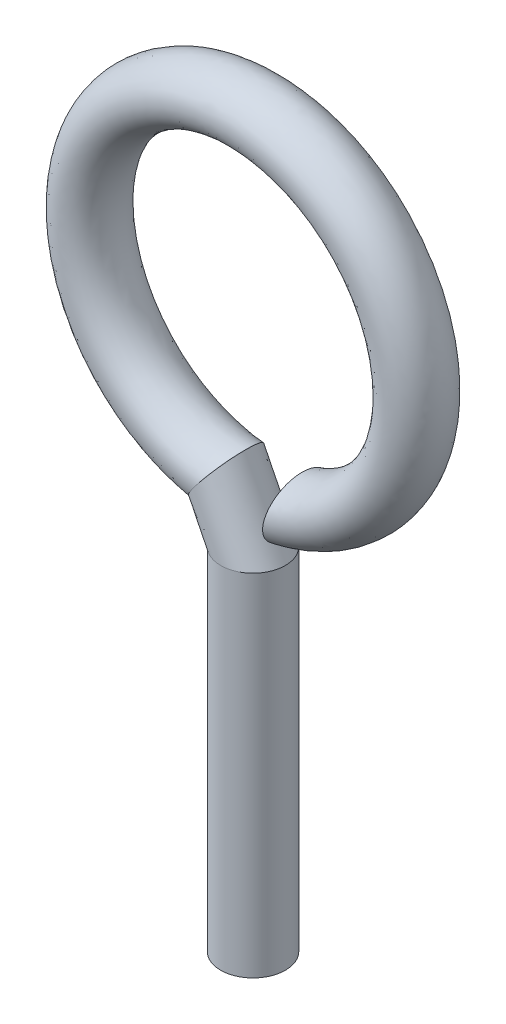
ISO-10303-21;
HEADER;
FILE_DESCRIPTION(('STEP AP214'),'2;1');
FILE_NAME('part.step','',(''),(''),'','','');
FILE_SCHEMA(('AUTOMOTIVE_DESIGN { 1 0 10303 214 1 1 1 1 }'));
ENDSEC;
DATA;
#1=APPLICATION_CONTEXT('core data for automotive mechanical design processes');
#2=APPLICATION_PROTOCOL_DEFINITION('international standard','automotive_design',2000,#1);
#3=PRODUCT_CONTEXT('',#1,'mechanical');
#4=PRODUCT('Part','Part','',(#3));
#5=PRODUCT_RELATED_PRODUCT_CATEGORY('part','',(#4));
#6=PRODUCT_DEFINITION_FORMATION('','',#4);
#7=PRODUCT_DEFINITION_CONTEXT('part definition',#1,'design');
#8=PRODUCT_DEFINITION('design','',#6,#7);
#9=PRODUCT_DEFINITION_SHAPE('','',#8);
#10=(LENGTH_UNIT() NAMED_UNIT(*) SI_UNIT(.MILLI.,.METRE.));
#11=(NAMED_UNIT(*) PLANE_ANGLE_UNIT() SI_UNIT($,.RADIAN.));
#12=(NAMED_UNIT(*) SI_UNIT($,.STERADIAN.) SOLID_ANGLE_UNIT());
#13=UNCERTAINTY_MEASURE_WITH_UNIT(LENGTH_MEASURE(1.E-05),#10,'distance_accuracy_value','');
#14=(GEOMETRIC_REPRESENTATION_CONTEXT(3) GLOBAL_UNCERTAINTY_ASSIGNED_CONTEXT((#13)) GLOBAL_UNIT_ASSIGNED_CONTEXT((#10,
#11,#12)) REPRESENTATION_CONTEXT('',''));
#15=CARTESIAN_POINT('',(0.,0.,0.));
#16=DIRECTION('',(0.,0.,1.));
#17=DIRECTION('',(1.,0.,0.));
#18=AXIS2_PLACEMENT_3D('',#15,#16,#17);
#19=CARTESIAN_POINT('',(0.,-13.,0.));
#20=DIRECTION('',(0.,1.,0.));
#21=DIRECTION('',(0.,0.,1.));
#22=AXIS2_PLACEMENT_3D('',#19,#20,#21);
#23=CYLINDRICAL_SURFACE('',#22,1.2);
#24=CARTESIAN_POINT('',(0.,-13.,0.));
#25=DIRECTION('',(0.,1.,0.));
#26=DIRECTION('',(0.,0.,1.));
#27=AXIS2_PLACEMENT_3D('',#24,#25,#26);
#28=CIRCLE('',#27,1.2);
#29=CARTESIAN_POINT('',(0.,-13.,1.2));
#30=VERTEX_POINT('',#29);
#31=EDGE_CURVE('E11',#30,#30,#28,.T.);
#32=CARTESIAN_POINT('',(0.,0.,0.));
#33=DIRECTION('',(0.,1.,0.));
#34=DIRECTION('',(0.,0.,1.));
#35=AXIS2_PLACEMENT_3D('',#32,#33,#34);
#36=CIRCLE('',#35,1.2);
#37=CARTESIAN_POINT('',(0.,0.,1.2));
#38=VERTEX_POINT('',#37);
#39=EDGE_CURVE('E40',#38,#38,#36,.T.);
#40=CARTESIAN_POINT('',(0.,-13.,1.2));
#41=CARTESIAN_POINT('',(0.,-12.8645833333333,1.2));
#42=CARTESIAN_POINT('',(0.,-12.7291666666667,1.2));
#43=CARTESIAN_POINT('',(0.,-12.4583333333333,1.2));
#44=CARTESIAN_POINT('',(0.,-12.3229166666667,1.2));
#45=CARTESIAN_POINT('',(0.,-12.0520833333333,1.2));
#46=CARTESIAN_POINT('',(0.,-11.9166666666667,1.2));
#47=CARTESIAN_POINT('',(0.,-11.6458333333333,1.2));
#48=CARTESIAN_POINT('',(0.,-11.5104166666667,1.2));
#49=CARTESIAN_POINT('',(0.,-11.2395833333333,1.2));
#50=CARTESIAN_POINT('',(0.,-11.1041666666667,1.2));
#51=CARTESIAN_POINT('',(0.,-10.8333333333333,1.2));
#52=CARTESIAN_POINT('',(0.,-10.6979166666667,1.2));
#53=CARTESIAN_POINT('',(0.,-10.4270833333333,1.2));
#54=CARTESIAN_POINT('',(0.,-10.2916666666667,1.2));
#55=CARTESIAN_POINT('',(0.,-10.0208333333333,1.2));
#56=CARTESIAN_POINT('',(0.,-9.88541666666667,1.2));
#57=CARTESIAN_POINT('',(0.,-9.61458333333333,1.2));
#58=CARTESIAN_POINT('',(0.,-9.47916666666667,1.2));
#59=CARTESIAN_POINT('',(0.,-9.20833333333333,1.2));
#60=CARTESIAN_POINT('',(0.,-9.07291666666667,1.2));
#61=CARTESIAN_POINT('',(0.,-8.80208333333333,1.2));
#62=CARTESIAN_POINT('',(0.,-8.66666666666667,1.2));
#63=CARTESIAN_POINT('',(0.,-8.39583333333333,1.2));
#64=CARTESIAN_POINT('',(0.,-8.26041666666667,1.2));
#65=CARTESIAN_POINT('',(0.,-7.98958333333333,1.2));
#66=CARTESIAN_POINT('',(0.,-7.85416666666667,1.2));
#67=CARTESIAN_POINT('',(0.,-7.58333333333333,1.2));
#68=CARTESIAN_POINT('',(0.,-7.44791666666667,1.2));
#69=CARTESIAN_POINT('',(0.,-7.17708333333333,1.2));
#70=CARTESIAN_POINT('',(0.,-7.04166666666667,1.2));
#71=CARTESIAN_POINT('',(0.,-6.77083333333333,1.2));
#72=CARTESIAN_POINT('',(0.,-6.63541666666667,1.2));
#73=CARTESIAN_POINT('',(0.,-6.36458333333333,1.2));
#74=CARTESIAN_POINT('',(0.,-6.22916666666667,1.2));
#75=CARTESIAN_POINT('',(0.,-5.95833333333333,1.2));
#76=CARTESIAN_POINT('',(0.,-5.82291666666667,1.2));
#77=CARTESIAN_POINT('',(0.,-5.55208333333333,1.2));
#78=CARTESIAN_POINT('',(0.,-5.41666666666667,1.2));
#79=CARTESIAN_POINT('',(0.,-5.14583333333333,1.2));
#80=CARTESIAN_POINT('',(0.,-5.01041666666667,1.2));
#81=CARTESIAN_POINT('',(0.,-4.73958333333333,1.2));
#82=CARTESIAN_POINT('',(0.,-4.60416666666667,1.2));
#83=CARTESIAN_POINT('',(0.,-4.33333333333333,1.2));
#84=CARTESIAN_POINT('',(0.,-4.19791666666667,1.2));
#85=CARTESIAN_POINT('',(0.,-3.92708333333333,1.2));
#86=CARTESIAN_POINT('',(0.,-3.79166666666667,1.2));
#87=CARTESIAN_POINT('',(0.,-3.52083333333333,1.2));
#88=CARTESIAN_POINT('',(0.,-3.38541666666667,1.2));
#89=CARTESIAN_POINT('',(0.,-3.11458333333333,1.2));
#90=CARTESIAN_POINT('',(0.,-2.97916666666667,1.2));
#91=CARTESIAN_POINT('',(0.,-2.70833333333333,1.2));
#92=CARTESIAN_POINT('',(0.,-2.57291666666667,1.2));
#93=CARTESIAN_POINT('',(0.,-2.30208333333333,1.2));
#94=CARTESIAN_POINT('',(0.,-2.16666666666667,1.2));
#95=CARTESIAN_POINT('',(0.,-1.89583333333333,1.2));
#96=CARTESIAN_POINT('',(0.,-1.76041666666667,1.2));
#97=CARTESIAN_POINT('',(0.,-1.48958333333333,1.2));
#98=CARTESIAN_POINT('',(0.,-1.35416666666667,1.2));
#99=CARTESIAN_POINT('',(0.,-1.08333333333333,1.2));
#100=CARTESIAN_POINT('',(0.,-0.947916666666667,1.2));
#101=CARTESIAN_POINT('',(0.,-0.677083333333334,1.2));
#102=CARTESIAN_POINT('',(0.,-0.541666666666667,1.2));
#103=CARTESIAN_POINT('',(0.,-0.270833333333334,1.2));
#104=CARTESIAN_POINT('',(0.,-0.135416666666667,1.2));
#105=CARTESIAN_POINT('',(0.,0.,1.2));
#106=B_SPLINE_CURVE_WITH_KNOTS('',3,(#40,#41,#42,#43,#44,#45,#46,#47,#48,#49,#50,#51,#52,#53,
#54,#55,#56,#57,#58,#59,#60,#61,#62,#63,#64,#65,#66,#67,#68,#69,#70,#71,#72,#73,#74,#75,#76,#77,
#78,#79,#80,#81,#82,#83,#84,#85,#86,#87,#88,#89,#90,#91,#92,#93,#94,#95,#96,#97,#98,#99,#100,
#101,#102,#103,#104,#105),.UNSPECIFIED.,.F.,.F.,(4,2,2,2,2,2,2,2,2,2,2,2,2,2,2,2,2,2,2,2,2,2,2,
2,2,2,2,2,2,2,2,2,4),(0.,0.40625,0.812500000000001,1.21875,1.625,2.03125,2.4375,2.84375,3.25,
3.65625,4.0625,4.46875,4.875,5.28125,5.6875,6.09375,6.5,6.90625,7.3125,7.71875,8.125,8.53125,
8.9375,9.34375,9.75,10.15625,10.5625,10.96875,11.375,11.78125,12.1875,12.59375,13.),.UNSPECIFIED.);
#107=EDGE_CURVE('BSEAM37',#30,#38,#106,.T.);
#108=ORIENTED_EDGE('',*,*,#31,.T.);
#109=ORIENTED_EDGE('',*,*,#39,.F.);
#110=ORIENTED_EDGE('',*,*,#107,.T.);
#111=ORIENTED_EDGE('',*,*,#107,.F.);
#112=EDGE_LOOP('',(#108,#110,#109,#111));
#113=FACE_BOUND('',#112,.T.);
#114=ADVANCED_FACE('F37',(#113),#23,.T.);
#115=CARTESIAN_POINT('',(0.,-13.,0.));
#116=DIRECTION('',(0.,1.,0.));
#117=DIRECTION('',(0.,0.,1.));
#118=AXIS2_PLACEMENT_3D('',#115,#116,#117);
#119=PLANE('',#118);
#120=ORIENTED_EDGE('',*,*,#31,.F.);
#121=EDGE_LOOP('',(#120));
#122=FACE_BOUND('',#121,.T.);
#123=ADVANCED_FACE('F120',(#122),#119,.F.);
#124=CARTESIAN_POINT('',(1.57829697631714,2.12627976509039,0.));
#125=DIRECTION('',(-0.980122448803098,0.198393511366218,0.));
#126=DIRECTION('',(0.,0.,1.));
#127=AXIS2_PLACEMENT_3D('',#124,#125,#126);
#128=PLANE('',#127);
#129=CARTESIAN_POINT('',(1.57829697631714,2.12627976509039,0.));
#130=DIRECTION('',(-0.980122448803098,0.198393511366218,0.));
#131=DIRECTION('',(0.,0.,1.));
#132=AXIS2_PLACEMENT_3D('',#129,#130,#131);
#133=CIRCLE('',#132,1.2);
#134=CARTESIAN_POINT('',(1.57829697631714,2.12627976509039,1.2));
#135=VERTEX_POINT('',#134);
#136=EDGE_CURVE('E59',#135,#135,#133,.T.);
#137=ORIENTED_EDGE('',*,*,#136,.T.);
#138=EDGE_LOOP('',(#137));
#139=FACE_BOUND('',#138,.T.);
#140=ADVANCED_FACE('F103',(#139),#128,.T.);
#141=CARTESIAN_POINT('',(-1.,2.,1.2));
#142=CARTESIAN_POINT('',(-10.7685790221015,3.63716008032253,1.2));
#143=CARTESIAN_POINT('',(-10.1889217484995,13.5250024478364,1.2));
#144=CARTESIAN_POINT('',(-0.29596197893008,14.009539585034,1.2));
#145=CARTESIAN_POINT('',(9.59699779063934,14.4940767222316,1.2));
#146=CARTESIAN_POINT('',(11.1401358080601,4.71020456961057,1.2));
#147=CARTESIAN_POINT('',(1.57829697631714,2.12627976509039,1.2));
#148=CARTESIAN_POINT('',(0.413363448717289,3.93969166669086,1.2));
#149=CARTESIAN_POINT('',(-6.17962980854364,3.26294952978646,1.2));
#150=CARTESIAN_POINT('',(-7.55981601152343,9.74528136757865,1.2));
#151=CARTESIAN_POINT('',(-1.26297808498893,11.8129786706447,1.2));
#152=CARTESIAN_POINT('',(5.03385984154557,13.8806759737108,1.2));
#153=CARTESIAN_POINT('',(7.76519860251891,7.84202309554709,1.2));
#154=CARTESIAN_POINT('',(2.05444140359607,4.47857364221782,1.2));
#155=CARTESIAN_POINT('',(0.413363448717289,3.93969166669086,-1.2));
#156=CARTESIAN_POINT('',(-6.17962980854364,3.26294952978646,-1.2));
#157=CARTESIAN_POINT('',(-7.55981601152343,9.74528136757865,-1.2));
#158=CARTESIAN_POINT('',(-1.26297808498893,11.8129786706447,-1.2));
#159=CARTESIAN_POINT('',(5.03385984154557,13.8806759737108,-1.2));
#160=CARTESIAN_POINT('',(7.76519860251891,7.84202309554709,-1.2));
#161=CARTESIAN_POINT('',(2.05444140359607,4.47857364221782,-1.2));
#162=CARTESIAN_POINT('',(-1.,2.,-1.2));
#163=CARTESIAN_POINT('',(-10.7685790221015,3.63716008032253,-1.2));
#164=CARTESIAN_POINT('',(-10.1889217484995,13.5250024478364,-1.2));
#165=CARTESIAN_POINT('',(-0.29596197893008,14.009539585034,-1.2));
#166=CARTESIAN_POINT('',(9.59699779063934,14.4940767222316,-1.2));
#167=CARTESIAN_POINT('',(11.1401358080601,4.71020456961057,-1.2));
#168=CARTESIAN_POINT('',(1.57829697631714,2.12627976509039,-1.2));
#169=CARTESIAN_POINT('',(-2.41336344871729,0.0603083333091388,-1.2));
#170=CARTESIAN_POINT('',(-15.3575282356593,4.01137063085859,-1.2));
#171=CARTESIAN_POINT('',(-12.8180274854756,17.3047235280942,-1.2));
#172=CARTESIAN_POINT('',(0.671054127128768,16.2061004994233,-1.2));
#173=CARTESIAN_POINT('',(14.1601357397331,15.1074774707524,-1.2));
#174=CARTESIAN_POINT('',(14.5150730136014,1.57838604367405,-1.2));
#175=CARTESIAN_POINT('',(1.10215254903822,-0.22601411203705,-1.2));
#176=CARTESIAN_POINT('',(-2.41336344871729,0.0603083333091388,1.2));
#177=CARTESIAN_POINT('',(-15.3575282356593,4.01137063085859,1.2));
#178=CARTESIAN_POINT('',(-12.8180274854756,17.3047235280942,1.2));
#179=CARTESIAN_POINT('',(0.671054127128768,16.2061004994233,1.2));
#180=CARTESIAN_POINT('',(14.1601357397331,15.1074774707524,1.2));
#181=CARTESIAN_POINT('',(14.5150730136014,1.57838604367405,1.2));
#182=CARTESIAN_POINT('',(1.10215254903822,-0.22601411203705,1.2));
#183=CARTESIAN_POINT('',(-1.,2.,1.2));
#184=CARTESIAN_POINT('',(-10.7685790221015,3.63716008032253,1.2));
#185=CARTESIAN_POINT('',(-10.1889217484995,13.5250024478364,1.2));
#186=CARTESIAN_POINT('',(-0.29596197893008,14.009539585034,1.2));
#187=CARTESIAN_POINT('',(9.59699779063934,14.4940767222316,1.2));
#188=CARTESIAN_POINT('',(11.1401358080601,4.71020456961057,1.2));
#189=CARTESIAN_POINT('',(1.57829697631714,2.12627976509039,1.2));
#190=(BOUNDED_SURFACE() B_SPLINE_SURFACE(3,3,((#141,#142,#143,#144,#145,#146,#147),(#148,#149,
#150,#151,#152,#153,#154),(#155,#156,#157,#158,#159,#160,#161),(#162,#163,#164,#165,#166,#167,
#168),(#169,#170,#171,#172,#173,#174,#175),(#176,#177,#178,#179,#180,#181,#182),(#183,#184,#185,
#186,#187,#188,#189)),.UNSPECIFIED.,.T.,.F.,.F.) B_SPLINE_SURFACE_WITH_KNOTS((4,3,4),(4,3,4),
(0.,0.5,1.),(0.,0.5,1.),
.UNSPECIFIED.) GEOMETRIC_REPRESENTATION_ITEM() RATIONAL_B_SPLINE_SURFACE(((1.,0.404858786465922,
0.404858786465922,1.,0.404858786465922,0.404858786465922,1.),(0.333333333333333,
0.134952928821974,0.134952928821974,0.333333333333333,0.134952928821974,0.134952928821974,
0.333333333333333),(0.333333333333333,0.134952928821974,0.134952928821974,0.333333333333333,
0.134952928821974,0.134952928821974,0.333333333333333),(1.,0.404858786465922,0.404858786465922,
1.,0.404858786465922,0.404858786465922,1.),(0.333333333333333,0.134952928821974,
0.134952928821974,0.333333333333333,0.134952928821974,0.134952928821974,0.333333333333333),
(0.333333333333333,0.134952928821974,0.134952928821974,0.333333333333333,0.134952928821974,
0.134952928821974,0.333333333333333),(1.,0.404858786465922,0.404858786465922,1.,
0.404858786465922,0.404858786465922,1.))) REPRESENTATION_ITEM('') SURFACE());
#191=CARTESIAN_POINT('',(-1.,2.,-1.2));
#192=CARTESIAN_POINT('',(-1.00136575858402,1.99815256353155,-1.20000004267239));
#193=CARTESIAN_POINT('',(-1.00273164772091,1.99630496755608,-1.19999348796303));
#194=CARTESIAN_POINT('',(-1.04434734851017,1.94001321521499,-1.19959293113571));
#195=CARTESIAN_POINT('',(-1.08468528978585,1.88546460933539,-1.1934812243104));
#196=CARTESIAN_POINT('',(-1.14428055078406,1.80489450178247,-1.1758704788702));
#197=CARTESIAN_POINT('',(-1.16402568316212,1.77820337681069,-1.16857388253917));
#198=CARTESIAN_POINT('',(-1.20310259324714,1.7253861409695,-1.1512029732536));
#199=CARTESIAN_POINT('',(-1.22243404725524,1.69926047239323,-1.1411265650295));
#200=CARTESIAN_POINT('',(-1.27949284939001,1.6221565338366,-1.10686919817826));
#201=CARTESIAN_POINT('',(-1.31638964343236,1.57230937470071,-1.07862887737107));
#202=CARTESIAN_POINT('',(-1.38683655112323,1.47715468802637,-1.01210102106342));
#203=CARTESIAN_POINT('',(-1.42038654741955,1.431847319671,-0.973813133425621));
#204=CARTESIAN_POINT('',(-1.46742600535277,1.36833335161721,-0.909753986337964));
#205=CARTESIAN_POINT('',(-1.48255209684411,1.34791149462682,-0.887308106624455));
#206=CARTESIAN_POINT('',(-1.51161048139586,1.30868245910117,-0.840375833996759));
#207=CARTESIAN_POINT('',(-1.52554391376907,1.28987373954773,-0.815891433554833));
#208=CARTESIAN_POINT('',(-1.56543139640605,1.23603325830582,-0.739573228549173));
#209=CARTESIAN_POINT('',(-1.58948185147579,1.20357472685259,-0.684861844074423));
#210=CARTESIAN_POINT('',(-1.63166964617949,1.14664331296994,-0.569614215223951));
#211=CARTESIAN_POINT('',(-1.64982484306826,1.12214631415674,-0.50909629473816));
#212=CARTESIAN_POINT('',(-1.67981525579534,1.081682323098,-0.383785471404203));
#213=CARTESIAN_POINT('',(-1.69165069878155,1.06571502427351,-0.318992722298226));
#214=CARTESIAN_POINT('',(-1.7086321525031,1.04280578065057,-0.187148257933134));
#215=CARTESIAN_POINT('',(-1.71379439105764,1.03584194134017,-0.12010243100938));
#216=CARTESIAN_POINT('',(-1.71733477524004,1.03106593918216,0.0144922494319597));
#217=CARTESIAN_POINT('',(-1.71571297151505,1.03325370801203,0.0820410991904051));
#218=CARTESIAN_POINT('',(-1.70573638875763,1.04671239721622,0.215647047852601));
#219=CARTESIAN_POINT('',(-1.69738910077839,1.0579732117507,0.281705722450311));
#220=CARTESIAN_POINT('',(-1.67421705552653,1.0892354894045,0.410528126017303));
#221=CARTESIAN_POINT('',(-1.65939221200056,1.10923706891349,0.473291811098933));
#222=CARTESIAN_POINT('',(-1.62366454289029,1.15744568070153,0.593818201487778));
#223=CARTESIAN_POINT('',(-1.60275809391214,1.18565760467222,0.651577898738115));
#224=CARTESIAN_POINT('',(-1.56733839920138,1.23346075687922,0.733129467945685));
#225=CARTESIAN_POINT('',(-1.55485279736345,1.25031254680223,0.759469207437981));
#226=CARTESIAN_POINT('',(-1.52859941617727,1.28574923409927,0.810322313805204));
#227=CARTESIAN_POINT('',(-1.51483042948636,1.30433576344967,0.83483392104593));
#228=CARTESIAN_POINT('',(-1.47171633093307,1.36253942403875,0.905384132159698));
#229=CARTESIAN_POINT('',(-1.44058188085842,1.40457660642681,0.948397224419647));
#230=CARTESIAN_POINT('',(-1.37447214350934,1.49385425909734,1.02504771848577));
#231=CARTESIAN_POINT('',(-1.33949681944176,1.54109477922452,1.05868503046696));
#232=CARTESIAN_POINT('',(-1.28480418032061,1.61498341766819,1.10151014194989));
#233=CARTESIAN_POINT('',(-1.26612212794151,1.64022513853364,1.1145501580915));
#234=CARTESIAN_POINT('',(-1.22819216743445,1.69147899662042,1.13792633155725));
#235=CARTESIAN_POINT('',(-1.20894476988449,1.71749043883562,1.14826484992831));
#236=CARTESIAN_POINT('',(-1.15058929260773,1.79636316381005,1.17509229721043));
#237=CARTESIAN_POINT('',(-1.11077639406927,1.8501864992712,1.18746458949689));
#238=CARTESIAN_POINT('',(-1.04854358995555,1.93434158331876,1.1978208237943));
#239=CARTESIAN_POINT('',(-1.02632010967185,1.96439787521591,1.19976719453107));
#240=CARTESIAN_POINT('',(-1.00273174843009,1.99630483155198,1.19999344097229));
#241=CARTESIAN_POINT('',(-1.00136586219158,1.99815242361617,1.19999999393411));
#242=CARTESIAN_POINT('',(-1.,2.,1.2));
#243=B_SPLINE_CURVE_WITH_KNOTS('',3,(#191,#192,#193,#194,#195,#196,#197,#198,#199,#200,#201,
#202,#203,#204,#205,#206,#207,#208,#209,#210,#211,#212,#213,#214,#215,#216,#217,#218,#219,#220,
#221,#222,#223,#224,#225,#226,#227,#228,#229,#230,#231,#232,#233,#234,#235,#236,#237,#238,#239,
#240,#241,#242),.UNSPECIFIED.,.F.,.F.,(4,2,2,2,2,2,2,2,2,2,2,2,2,2,2,2,2,2,2,2,2,2,2,2,2,4),(0.,
0.00689297414536255,0.209998455322182,0.311889744501519,0.413858044568573,0.617263697824213,
0.820676480795479,0.92229041349138,1.02380616806226,1.22677858546357,1.42913031840969,
1.63147477783426,1.83332624698189,2.03517620918385,2.23680165492415,2.4384297855359,
2.64017829220958,2.74108545313189,2.84208851934055,3.04424469651338,3.24640281038389,
3.34830354528064,3.4501149211322,3.65323499306246,3.76538085669445,3.77227383083981),.UNSPECIFIED.);
#244=CARTESIAN_POINT('',(-1.,2.,-1.2));
#245=VERTEX_POINT('',#244);
#246=CARTESIAN_POINT('',(-1.,2.,1.2));
#247=VERTEX_POINT('',#246);
#248=EDGE_CURVE('E50',#245,#247,#243,.T.);
#249=CARTESIAN_POINT('',(-1.,2.,0.));
#250=DIRECTION('',(-0.808204861121192,0.588901436965537,0.));
#251=DIRECTION('',(0.,0.,1.));
#252=AXIS2_PLACEMENT_3D('',#249,#250,#251);
#253=CIRCLE('',#252,1.2);
#254=EDGE_CURVE('E57',#247,#245,#253,.T.);
#255=ORIENTED_EDGE('',*,*,#136,.F.);
#256=EDGE_LOOP('',(#255));
#257=FACE_BOUND('',#256,.T.);
#258=ORIENTED_EDGE('',*,*,#248,.T.);
#259=ORIENTED_EDGE('',*,*,#254,.T.);
#260=EDGE_LOOP('',(#258,#259));
#261=FACE_BOUND('',#260,.T.);
#262=ADVANCED_FACE('F61',(#257,#261),#190,.T.);
#263=CARTESIAN_POINT('',(-0.802750973458889,1.96694214876033,1.2));
#264=CARTESIAN_POINT('',(-1.,2.,1.2));
#265=CARTESIAN_POINT('',(0.6106124752584,3.90663381545119,1.2));
#266=CARTESIAN_POINT('',(0.413363448717289,3.93969166669086,1.2));
#267=CARTESIAN_POINT('',(0.6106124752584,3.90663381545119,-1.2));
#268=CARTESIAN_POINT('',(0.413363448717289,3.93969166669086,-1.2));
#269=CARTESIAN_POINT('',(-0.802750973458889,1.96694214876033,-1.2));
#270=CARTESIAN_POINT('',(-1.,2.,-1.2));
#271=CARTESIAN_POINT('',(-2.21611442217618,0.0272504820694694,-1.2));
#272=CARTESIAN_POINT('',(-2.41336344871729,0.0603083333091388,-1.2));
#273=CARTESIAN_POINT('',(-2.21611442217618,0.0272504820694694,1.2));
#274=CARTESIAN_POINT('',(-2.41336344871729,0.0603083333091388,1.2));
#275=CARTESIAN_POINT('',(-0.802750973458889,1.96694214876033,1.2));
#276=CARTESIAN_POINT('',(-1.,2.,1.2));
#277=(BOUNDED_SURFACE() B_SPLINE_SURFACE(3,1,((#263,#264),(#265,#266),(#267,#268),(#269,#270),
(#271,#272),(#273,#274),(#275,#276)),.UNSPECIFIED.,.T.,.F.,.F.) B_SPLINE_SURFACE_WITH_KNOTS((4,
3,4),(2,2),(0.,0.5,1.),(0.,1.),
.UNSPECIFIED.) GEOMETRIC_REPRESENTATION_ITEM() RATIONAL_B_SPLINE_SURFACE(((1.,1.),
(0.333333333333333,0.333333333333333),(0.333333333333333,0.333333333333333),(1.,1.),
(0.333333333333333,0.333333333333333),(0.333333333333333,0.333333333333333),(1.,1.))) REPRESENTATION_ITEM('') SURFACE());
#278=CARTESIAN_POINT('',(-1.,2.,1.2));
#279=CARTESIAN_POINT('',(-0.998634241297184,2.00184743639523,1.2000000426759));
#280=CARTESIAN_POINT('',(-0.997268360222871,2.0036950383201,1.19999348796854));
#281=CARTESIAN_POINT('',(-0.955617341957125,2.06003559605093,1.19959258894018));
#282=CARTESIAN_POINT('',(-0.915250983998211,2.11463841767841,1.1934704183772));
#283=CARTESIAN_POINT('',(-0.855624417544332,2.1952941651118,1.17583227912322));
#284=CARTESIAN_POINT('',(-0.835870665752565,2.22201469775577,1.16852453388646));
#285=CARTESIAN_POINT('',(-0.796780102966325,2.27489177498199,1.15112787957473));
#286=CARTESIAN_POINT('',(-0.777443618560765,2.3010478777935,1.1410368715481));
#287=CARTESIAN_POINT('',(-0.720375558338281,2.37824278143396,1.10673170001912));
#288=CARTESIAN_POINT('',(-0.683479571324027,2.42815129683086,1.07845389427251));
#289=CARTESIAN_POINT('',(-0.613045147481821,2.52342663193552,1.01184174031629));
#290=CARTESIAN_POINT('',(-0.579506826879716,2.56879329442674,0.973507044152904));
#291=CARTESIAN_POINT('',(-0.532494199544618,2.63238640102383,0.909375773343003));
#292=CARTESIAN_POINT('',(-0.517379970698208,2.65283113727122,0.886908171674572));
#293=CARTESIAN_POINT('',(-0.488346596887789,2.69210404202591,0.839931243527716));
#294=CARTESIAN_POINT('',(-0.47442631075264,2.71093375417419,0.815423911795025));
#295=CARTESIAN_POINT('',(-0.434579855942909,2.76483331248157,0.739035043671988));
#296=CARTESIAN_POINT('',(-0.410558798283819,2.79732615040363,0.684273936553917));
#297=CARTESIAN_POINT('',(-0.368439095583231,2.8543006888523,0.568940415750976));
#298=CARTESIAN_POINT('',(-0.350320789791304,2.87880898411033,0.508388181291363));
#299=CARTESIAN_POINT('',(-0.320402776716214,2.91927852394473,0.383009116300718));
#300=CARTESIAN_POINT('',(-0.308602820301225,2.93524010551707,0.318182454423112));
#301=CARTESIAN_POINT('',(-0.291695743607622,2.95810999370175,0.186314744607856));
#302=CARTESIAN_POINT('',(-0.286568276253226,2.96504582342505,0.119281070824427));
#303=CARTESIAN_POINT('',(-0.283086659836205,2.96975534119694,-0.0152819553058566));
#304=CARTESIAN_POINT('',(-0.284732443409628,2.96752912036749,-0.0828113027162784));
#305=CARTESIAN_POINT('',(-0.294743500210569,2.9539873500309,-0.216345278454158));
#306=CARTESIAN_POINT('',(-0.303098819134239,2.94268526552542,-0.282352016602924));
#307=CARTESIAN_POINT('',(-0.32626995644066,2.91134209905655,-0.411065521914569));
#308=CARTESIAN_POINT('',(-0.341085849752011,2.89130091573863,-0.473772250795069));
#309=CARTESIAN_POINT('',(-0.376782557329759,2.84301464332981,-0.594195532755847));
#310=CARTESIAN_POINT('',(-0.397668167860342,2.81476306642155,-0.651908092480182));
#311=CARTESIAN_POINT('',(-0.433047500195079,2.76690610160101,-0.733390956387218));
#312=CARTESIAN_POINT('',(-0.445518213357669,2.75003719985176,-0.759708265230384));
#313=CARTESIAN_POINT('',(-0.471739187457644,2.71456857587689,-0.810517795078182));
#314=CARTESIAN_POINT('',(-0.485490661321774,2.69596721294783,-0.835008245638701));
#315=CARTESIAN_POINT('',(-0.528666912945143,2.63756350042232,-0.905690858070594));
#316=CARTESIAN_POINT('',(-0.559897443282278,2.59531854289938,-0.948827285572709));
#317=CARTESIAN_POINT('',(-0.626223604997744,2.50560037756301,-1.02565510196396));
#318=CARTESIAN_POINT('',(-0.661319268507381,2.45812712628616,-1.05934641232648));
#319=CARTESIAN_POINT('',(-0.716098099191209,2.38402882086472,-1.10211155689239));
#320=CARTESIAN_POINT('',(-0.734735635475272,2.35881817217726,-1.11508143840098));
#321=CARTESIAN_POINT('',(-0.772574060693953,2.30763483814986,-1.1383296257355));
#322=CARTESIAN_POINT('',(-0.791774437569155,2.28166284546317,-1.1486102985021));
#323=CARTESIAN_POINT('',(-0.849987156512371,2.202919583261,-1.17528359863666));
#324=CARTESIAN_POINT('',(-0.889702565094232,2.1491972887488,-1.18757872907154));
#325=CARTESIAN_POINT('',(-0.951712025813233,2.06531824456279,-1.19784295110563));
#326=CARTESIAN_POINT('',(-0.973806612950727,2.03543130748426,-1.19976840933728));
#327=CARTESIAN_POINT('',(-0.997268259299843,2.00369517483678,-1.19999344093305));
#328=CARTESIAN_POINT('',(-0.998634137471283,2.00184757683858,-1.19999999389));
#329=CARTESIAN_POINT('',(-1.,2.,-1.2));
#330=B_SPLINE_CURVE_WITH_KNOTS('',3,(#278,#279,#280,#281,#282,#283,#284,#285,#286,#287,#288,
#289,#290,#291,#292,#293,#294,#295,#296,#297,#298,#299,#300,#301,#302,#303,#304,#305,#306,#307,
#308,#309,#310,#311,#312,#313,#314,#315,#316,#317,#318,#319,#320,#321,#322,#323,#324,#325,#326,
#327,#328,#329),.UNSPECIFIED.,.F.,.F.,(4,2,2,2,2,2,2,2,2,2,2,2,2,2,2,2,2,2,2,2,2,2,2,2,2,4),(0.,
0.00689297414504865,0.210179164065487,0.312161811631659,0.414221579007277,0.617805918709611,
0.821397303062632,0.923079759431239,1.0246639186775,1.22777259176698,1.4301976692127,
1.63261476447188,1.83441315171348,2.03620953195666,2.23770707787302,2.43920696078449,
2.64086650298736,2.74173036548442,2.84269074030457,3.04559110631123,3.24849315917979,
3.35017180536221,3.45176065437186,3.65443585117881,3.76594366962368,3.77283664376872),.UNSPECIFIED.);
#331=EDGE_CURVE('E55',#245,#247,#330,.F.);
#332=ORIENTED_EDGE('',*,*,#331,.F.);
#333=ORIENTED_EDGE('',*,*,#254,.F.);
#334=EDGE_LOOP('',(#332,#333));
#335=FACE_BOUND('',#334,.T.);
#336=ADVANCED_FACE('F56',(#335),#277,.T.);
#337=CARTESIAN_POINT('',(0.,0.,1.2));
#338=CARTESIAN_POINT('',(-2.10986250215851,4.21972500431702,1.2));
#339=CARTESIAN_POINT('',(2.4,0.,1.2));
#340=CARTESIAN_POINT('',(0.290137497841489,4.21972500431702,1.2));
#341=CARTESIAN_POINT('',(2.4,0.,-1.2));
#342=CARTESIAN_POINT('',(0.290137497841489,4.21972500431702,-1.2));
#343=CARTESIAN_POINT('',(0.,0.,-1.2));
#344=CARTESIAN_POINT('',(-2.10986250215851,4.21972500431702,-1.2));
#345=CARTESIAN_POINT('',(-2.4,0.,-1.2));
#346=CARTESIAN_POINT('',(-4.50986250215851,4.21972500431702,-1.2));
#347=CARTESIAN_POINT('',(-2.4,0.,1.2));
#348=CARTESIAN_POINT('',(-4.50986250215851,4.21972500431702,1.2));
#349=CARTESIAN_POINT('',(0.,0.,1.2));
#350=CARTESIAN_POINT('',(-2.10986250215851,4.21972500431702,1.2));
#351=(BOUNDED_SURFACE() B_SPLINE_SURFACE(3,1,((#337,#338),(#339,#340),(#341,#342),(#343,#344),
(#345,#346),(#347,#348),(#349,#350)),.UNSPECIFIED.,.T.,.F.,.F.) B_SPLINE_SURFACE_WITH_KNOTS((4,
3,4),(2,2),(0.,0.5,1.),(0.,1.),
.UNSPECIFIED.) GEOMETRIC_REPRESENTATION_ITEM() RATIONAL_B_SPLINE_SURFACE(((1.,1.),
(0.333333333333333,0.333333333333333),(0.333333333333333,0.333333333333333),(1.,1.),
(0.333333333333333,0.333333333333333),(0.333333333333333,0.333333333333333),(1.,1.))) REPRESENTATION_ITEM('') SURFACE());
#352=ORIENTED_EDGE('',*,*,#248,.F.);
#353=ORIENTED_EDGE('',*,*,#331,.T.);
#354=EDGE_LOOP('',(#352,#353));
#355=FACE_BOUND('',#354,.T.);
#356=ORIENTED_EDGE('',*,*,#39,.T.);
#357=EDGE_LOOP('',(#356));
#358=FACE_BOUND('',#357,.T.);
#359=ADVANCED_FACE('F63',(#355,#358),#351,.T.);
#360=CLOSED_SHELL('',(#114,#123,#140,#262,#336,#359));
#361=MANIFOLD_SOLID_BREP('B2',#360);
#362=ADVANCED_BREP_SHAPE_REPRESENTATION('',(#18,#361),#14);
#363=SHAPE_DEFINITION_REPRESENTATION(#9,#362);
ENDSEC;
END-ISO-10303-21;
